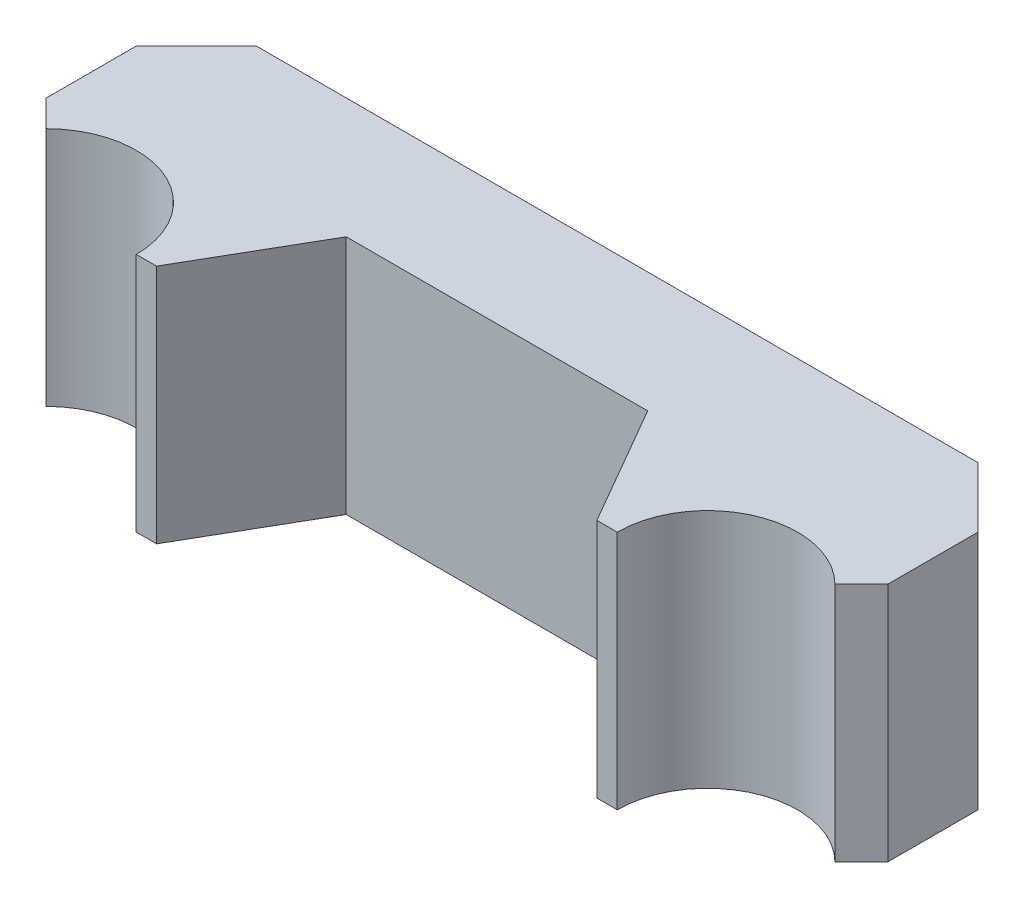
ISO-10303-21;
HEADER;
FILE_DESCRIPTION(('STEP AP214'),'2;1');
FILE_NAME('part.step','',(''),(''),'','','');
FILE_SCHEMA(('AUTOMOTIVE_DESIGN { 1 0 10303 214 1 1 1 1 }'));
ENDSEC;
DATA;
#1=APPLICATION_CONTEXT('core data for automotive mechanical design processes');
#2=APPLICATION_PROTOCOL_DEFINITION('international standard','automotive_design',2000,#1);
#3=PRODUCT_CONTEXT('',#1,'mechanical');
#4=PRODUCT('Part','Part','',(#3));
#5=PRODUCT_RELATED_PRODUCT_CATEGORY('part','',(#4));
#6=PRODUCT_DEFINITION_FORMATION('','',#4);
#7=PRODUCT_DEFINITION_CONTEXT('part definition',#1,'design');
#8=PRODUCT_DEFINITION('design','',#6,#7);
#9=PRODUCT_DEFINITION_SHAPE('','',#8);
#10=(LENGTH_UNIT() NAMED_UNIT(*) SI_UNIT(.MILLI.,.METRE.));
#11=(NAMED_UNIT(*) PLANE_ANGLE_UNIT() SI_UNIT($,.RADIAN.));
#12=(NAMED_UNIT(*) SI_UNIT($,.STERADIAN.) SOLID_ANGLE_UNIT());
#13=UNCERTAINTY_MEASURE_WITH_UNIT(LENGTH_MEASURE(1.E-05),#10,'distance_accuracy_value','');
#14=(GEOMETRIC_REPRESENTATION_CONTEXT(3) GLOBAL_UNCERTAINTY_ASSIGNED_CONTEXT((#13)) GLOBAL_UNIT_ASSIGNED_CONTEXT((#10,
#11,#12)) REPRESENTATION_CONTEXT('',''));
#15=CARTESIAN_POINT('',(0.,0.,0.));
#16=DIRECTION('',(0.,0.,1.));
#17=DIRECTION('',(1.,0.,0.));
#18=AXIS2_PLACEMENT_3D('',#15,#16,#17);
#19=CARTESIAN_POINT('',(0.,10.,-20.));
#20=DIRECTION('',(0.,0.,1.));
#21=DIRECTION('',(1.,0.,0.));
#22=AXIS2_PLACEMENT_3D('',#19,#20,#21);
#23=PLANE('',#22);
#24=DIRECTION('',(-1.,0.,0.));
#25=VECTOR('',#24,1.);
#26=CARTESIAN_POINT('',(0.,-10.,-20.));
#27=LINE('',#26,#25);
#28=CARTESIAN_POINT('',(30.,-10.,-20.));
#29=VERTEX_POINT('',#28);
#30=CARTESIAN_POINT('',(-30.,-10.,-20.));
#31=VERTEX_POINT('',#30);
#32=EDGE_CURVE('E132',#29,#31,#27,.T.);
#33=ORIENTED_EDGE('',*,*,#32,.T.);
#34=DIRECTION('',(0.,-1.,0.));
#35=VECTOR('',#34,1.);
#36=CARTESIAN_POINT('',(-30.,10.,-20.));
#37=LINE('',#36,#35);
#38=CARTESIAN_POINT('',(-30.,10.,-20.));
#39=VERTEX_POINT('',#38);
#40=EDGE_CURVE('E11',#39,#31,#37,.T.);
#41=ORIENTED_EDGE('',*,*,#40,.F.);
#42=DIRECTION('',(-1.,0.,0.));
#43=VECTOR('',#42,1.);
#44=CARTESIAN_POINT('',(0.,10.,-20.));
#45=LINE('',#44,#43);
#46=CARTESIAN_POINT('',(30.,10.,-20.));
#47=VERTEX_POINT('',#46);
#48=EDGE_CURVE('E87',#47,#39,#45,.T.);
#49=ORIENTED_EDGE('',*,*,#48,.F.);
#50=DIRECTION('',(0.,-1.,0.));
#51=VECTOR('',#50,1.);
#52=CARTESIAN_POINT('',(30.,10.,-20.));
#53=LINE('',#52,#51);
#54=EDGE_CURVE('E136',#47,#29,#53,.T.);
#55=ORIENTED_EDGE('',*,*,#54,.T.);
#56=EDGE_LOOP('',(#33,#41,#49,#55));
#57=FACE_BOUND('',#56,.T.);
#58=ADVANCED_FACE('F35',(#57),#23,.F.);
#59=CARTESIAN_POINT('',(-24.9999999999999,10.,-25.0000000000001));
#60=DIRECTION('',(-0.707106781186544,0.,-0.707106781186551));
#61=DIRECTION('',(-0.707106781186551,0.,0.707106781186544));
#62=AXIS2_PLACEMENT_3D('',#59,#60,#61);
#63=PLANE('',#62);
#64=DIRECTION('',(0.707106781186551,0.,-0.707106781186544));
#65=VECTOR('',#64,1.);
#66=CARTESIAN_POINT('',(-24.9999999999999,-10.,-25.0000000000001));
#67=LINE('',#66,#65);
#68=CARTESIAN_POINT('',(-35.,-10.,-15.));
#69=VERTEX_POINT('',#68);
#70=EDGE_CURVE('E135',#69,#31,#67,.T.);
#71=ORIENTED_EDGE('',*,*,#70,.F.);
#72=DIRECTION('',(0.,-1.,0.));
#73=VECTOR('',#72,1.);
#74=CARTESIAN_POINT('',(-35.,10.,-15.));
#75=LINE('',#74,#73);
#76=CARTESIAN_POINT('',(-35.,10.,-15.));
#77=VERTEX_POINT('',#76);
#78=EDGE_CURVE('E43',#77,#69,#75,.T.);
#79=ORIENTED_EDGE('',*,*,#78,.F.);
#80=DIRECTION('',(0.707106781186551,0.,-0.707106781186544));
#81=VECTOR('',#80,1.);
#82=CARTESIAN_POINT('',(-24.9999999999999,10.,-25.0000000000001));
#83=LINE('',#82,#81);
#84=EDGE_CURVE('E173',#77,#39,#83,.T.);
#85=ORIENTED_EDGE('',*,*,#84,.T.);
#86=ORIENTED_EDGE('',*,*,#40,.T.);
#87=EDGE_LOOP('',(#71,#79,#85,#86));
#88=FACE_BOUND('',#87,.T.);
#89=ADVANCED_FACE('F166',(#88),#63,.T.);
#90=CARTESIAN_POINT('',(-35.,10.,0.));
#91=DIRECTION('',(-1.,0.,0.));
#92=DIRECTION('',(0.,0.,1.));
#93=AXIS2_PLACEMENT_3D('',#90,#91,#92);
#94=PLANE('',#93);
#95=DIRECTION('',(0.,0.,-1.));
#96=VECTOR('',#95,1.);
#97=CARTESIAN_POINT('',(-35.,-10.,0.));
#98=LINE('',#97,#96);
#99=CARTESIAN_POINT('',(-35.,-10.,-7.50000000000008));
#100=VERTEX_POINT('',#99);
#101=EDGE_CURVE('E139',#100,#69,#98,.T.);
#102=ORIENTED_EDGE('',*,*,#101,.F.);
#103=DIRECTION('',(0.,-1.,0.));
#104=VECTOR('',#103,1.);
#105=CARTESIAN_POINT('',(-35.,10.,-7.50000000000008));
#106=LINE('',#105,#104);
#107=CARTESIAN_POINT('',(-35.,10.,-7.50000000000008));
#108=VERTEX_POINT('',#107);
#109=EDGE_CURVE('E157',#108,#100,#106,.T.);
#110=ORIENTED_EDGE('',*,*,#109,.F.);
#111=DIRECTION('',(0.,0.,-1.));
#112=VECTOR('',#111,1.);
#113=CARTESIAN_POINT('',(-35.,10.,0.));
#114=LINE('',#113,#112);
#115=EDGE_CURVE('E163',#108,#77,#114,.T.);
#116=ORIENTED_EDGE('',*,*,#115,.T.);
#117=ORIENTED_EDGE('',*,*,#78,.T.);
#118=EDGE_LOOP('',(#102,#110,#116,#117));
#119=FACE_BOUND('',#118,.T.);
#120=ADVANCED_FACE('F162',(#119),#94,.T.);
#121=CARTESIAN_POINT('',(-13.7500000000001,10.,13.75));
#122=DIRECTION('',(0.707106781186551,0.,-0.707106781186544));
#123=DIRECTION('',(-0.707106781186544,0.,-0.707106781186551));
#124=AXIS2_PLACEMENT_3D('',#121,#122,#123);
#125=PLANE('',#124);
#126=DIRECTION('',(0.707106781186544,0.,0.707106781186551));
#127=VECTOR('',#126,1.);
#128=CARTESIAN_POINT('',(-13.7500000000001,-10.,13.75));
#129=LINE('',#128,#127);
#130=CARTESIAN_POINT('',(-32.8033008588991,-10.,-5.30330085889914));
#131=VERTEX_POINT('',#130);
#132=EDGE_CURVE('E142',#100,#131,#129,.T.);
#133=ORIENTED_EDGE('',*,*,#132,.T.);
#134=DIRECTION('',(0.,-1.,0.));
#135=VECTOR('',#134,1.);
#136=CARTESIAN_POINT('',(-32.8033008588991,10.,-5.30330085889914));
#137=LINE('',#136,#135);
#138=CARTESIAN_POINT('',(-32.8033008588991,10.,-5.30330085889914));
#139=VERTEX_POINT('',#138);
#140=EDGE_CURVE('E113',#139,#131,#137,.T.);
#141=ORIENTED_EDGE('',*,*,#140,.F.);
#142=DIRECTION('',(0.707106781186544,0.,0.707106781186551));
#143=VECTOR('',#142,1.);
#144=CARTESIAN_POINT('',(-13.7500000000001,10.,13.75));
#145=LINE('',#144,#143);
#146=EDGE_CURVE('E121',#108,#139,#145,.T.);
#147=ORIENTED_EDGE('',*,*,#146,.F.);
#148=ORIENTED_EDGE('',*,*,#109,.T.);
#149=EDGE_LOOP('',(#133,#141,#147,#148));
#150=FACE_BOUND('',#149,.T.);
#151=ADVANCED_FACE('F172',(#150),#125,.F.);
#152=CARTESIAN_POINT('',(-27.5,10.,0.));
#153=DIRECTION('',(0.,-1.,0.));
#154=DIRECTION('',(0.,0.,-1.));
#155=AXIS2_PLACEMENT_3D('',#152,#153,#154);
#156=CYLINDRICAL_SURFACE('',#155,7.5);
#157=CARTESIAN_POINT('',(-27.5,-10.,0.));
#158=DIRECTION('',(0.,1.,0.));
#159=DIRECTION('',(0.,0.,1.));
#160=AXIS2_PLACEMENT_3D('',#157,#158,#159);
#161=CIRCLE('',#160,7.5);
#162=CARTESIAN_POINT('',(-20.,-10.,0.));
#163=VERTEX_POINT('',#162);
#164=EDGE_CURVE('E109',#163,#131,#161,.T.);
#165=ORIENTED_EDGE('',*,*,#164,.F.);
#166=DIRECTION('',(0.,-1.,0.));
#167=VECTOR('',#166,1.);
#168=CARTESIAN_POINT('',(-20.,10.,0.));
#169=LINE('',#168,#167);
#170=CARTESIAN_POINT('',(-20.,10.,0.));
#171=VERTEX_POINT('',#170);
#172=EDGE_CURVE('E104',#171,#163,#169,.T.);
#173=ORIENTED_EDGE('',*,*,#172,.F.);
#174=CARTESIAN_POINT('',(-27.5,10.,0.));
#175=DIRECTION('',(0.,1.,0.));
#176=DIRECTION('',(0.,0.,1.));
#177=AXIS2_PLACEMENT_3D('',#174,#175,#176);
#178=CIRCLE('',#177,7.5);
#179=EDGE_CURVE('E107',#171,#139,#178,.T.);
#180=ORIENTED_EDGE('',*,*,#179,.T.);
#181=ORIENTED_EDGE('',*,*,#140,.T.);
#182=EDGE_LOOP('',(#165,#173,#180,#181));
#183=FACE_BOUND('',#182,.T.);
#184=ADVANCED_FACE('F106',(#183),#156,.F.);
#185=CARTESIAN_POINT('',(0.,10.,0.));
#186=DIRECTION('',(0.,0.,1.));
#187=DIRECTION('',(1.,0.,0.));
#188=AXIS2_PLACEMENT_3D('',#185,#186,#187);
#189=PLANE('',#188);
#190=DIRECTION('',(-1.,0.,0.));
#191=VECTOR('',#190,1.);
#192=CARTESIAN_POINT('',(0.,-10.,0.));
#193=LINE('',#192,#191);
#194=CARTESIAN_POINT('',(-18.3077476786496,-10.,0.));
#195=VERTEX_POINT('',#194);
#196=EDGE_CURVE('E146',#195,#163,#193,.T.);
#197=ORIENTED_EDGE('',*,*,#196,.F.);
#198=DIRECTION('',(0.,-1.,0.));
#199=VECTOR('',#198,1.);
#200=CARTESIAN_POINT('',(-18.3077476786496,10.,0.));
#201=LINE('',#200,#199);
#202=CARTESIAN_POINT('',(-18.3077476786496,10.,0.));
#203=VERTEX_POINT('',#202);
#204=EDGE_CURVE('E74',#203,#195,#201,.T.);
#205=ORIENTED_EDGE('',*,*,#204,.F.);
#206=DIRECTION('',(-1.,0.,0.));
#207=VECTOR('',#206,1.);
#208=CARTESIAN_POINT('',(0.,10.,0.));
#209=LINE('',#208,#207);
#210=EDGE_CURVE('E118',#203,#171,#209,.T.);
#211=ORIENTED_EDGE('',*,*,#210,.T.);
#212=ORIENTED_EDGE('',*,*,#172,.T.);
#213=EDGE_LOOP('',(#197,#205,#211,#212));
#214=FACE_BOUND('',#213,.T.);
#215=ADVANCED_FACE('F124',(#214),#189,.T.);
#216=CARTESIAN_POINT('',(-13.7308107589873,10.,-7.92748728789306));
#217=DIRECTION('',(0.86602540378444,0.,0.499999999999998));
#218=DIRECTION('',(0.499999999999998,0.,-0.86602540378444));
#219=AXIS2_PLACEMENT_3D('',#216,#217,#218);
#220=PLANE('',#219);
#221=DIRECTION('',(-0.499999999999998,0.,0.86602540378444));
#222=VECTOR('',#221,1.);
#223=CARTESIAN_POINT('',(-13.7308107589873,-10.,-7.92748728789306));
#224=LINE('',#223,#222);
#225=CARTESIAN_POINT('',(-12.5342449867534,-10.,-10.));
#226=VERTEX_POINT('',#225);
#227=EDGE_CURVE('E148',#226,#195,#224,.T.);
#228=ORIENTED_EDGE('',*,*,#227,.F.);
#229=DIRECTION('',(0.,-1.,0.));
#230=VECTOR('',#229,1.);
#231=CARTESIAN_POINT('',(-12.5342449867534,10.,-10.));
#232=LINE('',#231,#230);
#233=CARTESIAN_POINT('',(-12.5342449867534,10.,-10.));
#234=VERTEX_POINT('',#233);
#235=EDGE_CURVE('E51',#234,#226,#232,.T.);
#236=ORIENTED_EDGE('',*,*,#235,.F.);
#237=DIRECTION('',(-0.499999999999998,0.,0.86602540378444));
#238=VECTOR('',#237,1.);
#239=CARTESIAN_POINT('',(-13.7308107589873,10.,-7.92748728789306));
#240=LINE('',#239,#238);
#241=EDGE_CURVE('E125',#234,#203,#240,.T.);
#242=ORIENTED_EDGE('',*,*,#241,.T.);
#243=ORIENTED_EDGE('',*,*,#204,.T.);
#244=EDGE_LOOP('',(#228,#236,#242,#243));
#245=FACE_BOUND('',#244,.T.);
#246=ADVANCED_FACE('F284',(#245),#220,.T.);
#247=CARTESIAN_POINT('',(0.,10.,-10.));
#248=DIRECTION('',(0.,0.,1.));
#249=DIRECTION('',(1.,0.,0.));
#250=AXIS2_PLACEMENT_3D('',#247,#248,#249);
#251=PLANE('',#250);
#252=DIRECTION('',(-1.,0.,0.));
#253=VECTOR('',#252,1.);
#254=CARTESIAN_POINT('',(0.,-10.,-10.));
#255=LINE('',#254,#253);
#256=CARTESIAN_POINT('',(12.5342449867534,-10.,-10.));
#257=VERTEX_POINT('',#256);
#258=EDGE_CURVE('E151',#257,#226,#255,.T.);
#259=ORIENTED_EDGE('',*,*,#258,.F.);
#260=DIRECTION('',(0.,-1.,0.));
#261=VECTOR('',#260,1.);
#262=CARTESIAN_POINT('',(12.5342449867534,10.,-10.));
#263=LINE('',#262,#261);
#264=CARTESIAN_POINT('',(12.5342449867534,10.,-10.));
#265=VERTEX_POINT('',#264);
#266=EDGE_CURVE('E195',#265,#257,#263,.T.);
#267=ORIENTED_EDGE('',*,*,#266,.F.);
#268=DIRECTION('',(-1.,0.,0.));
#269=VECTOR('',#268,1.);
#270=CARTESIAN_POINT('',(0.,10.,-10.));
#271=LINE('',#270,#269);
#272=EDGE_CURVE('E127',#265,#234,#271,.T.);
#273=ORIENTED_EDGE('',*,*,#272,.T.);
#274=ORIENTED_EDGE('',*,*,#235,.T.);
#275=EDGE_LOOP('',(#259,#267,#273,#274));
#276=FACE_BOUND('',#275,.T.);
#277=ADVANCED_FACE('F262',(#276),#251,.T.);
#278=CARTESIAN_POINT('',(0.,10.,0.));
#279=DIRECTION('',(0.,1.,0.));
#280=DIRECTION('',(0.,0.,1.));
#281=AXIS2_PLACEMENT_3D('',#278,#279,#280);
#282=PLANE('',#281);
#283=ORIENTED_EDGE('',*,*,#272,.F.);
#284=DIRECTION('',(0.499999999999998,0.,0.86602540378444));
#285=VECTOR('',#284,1.);
#286=CARTESIAN_POINT('',(13.7308107589873,10.,-7.92748728789306));
#287=LINE('',#286,#285);
#288=CARTESIAN_POINT('',(18.3077476786496,10.,0.));
#289=VERTEX_POINT('',#288);
#290=EDGE_CURVE('E198',#265,#289,#287,.T.);
#291=ORIENTED_EDGE('',*,*,#290,.T.);
#292=DIRECTION('',(1.,0.,0.));
#293=VECTOR('',#292,1.);
#294=CARTESIAN_POINT('',(0.,10.,0.));
#295=LINE('',#294,#293);
#296=CARTESIAN_POINT('',(20.,10.,0.));
#297=VERTEX_POINT('',#296);
#298=EDGE_CURVE('E220',#289,#297,#295,.T.);
#299=ORIENTED_EDGE('',*,*,#298,.T.);
#300=CARTESIAN_POINT('',(27.5,10.,0.));
#301=DIRECTION('',(0.,-1.,0.));
#302=DIRECTION('',(0.,0.,1.));
#303=AXIS2_PLACEMENT_3D('',#300,#301,#302);
#304=CIRCLE('',#303,7.5);
#305=CARTESIAN_POINT('',(32.8033008588991,10.,-5.30330085889914));
#306=VERTEX_POINT('',#305);
#307=EDGE_CURVE('E223',#297,#306,#304,.T.);
#308=ORIENTED_EDGE('',*,*,#307,.T.);
#309=DIRECTION('',(-0.707106781186544,0.,0.707106781186551));
#310=VECTOR('',#309,1.);
#311=CARTESIAN_POINT('',(13.7500000000001,10.,13.75));
#312=LINE('',#311,#310);
#313=CARTESIAN_POINT('',(35.,10.,-7.50000000000008));
#314=VERTEX_POINT('',#313);
#315=EDGE_CURVE('E226',#314,#306,#312,.T.);
#316=ORIENTED_EDGE('',*,*,#315,.F.);
#317=DIRECTION('',(0.,0.,-1.));
#318=VECTOR('',#317,1.);
#319=CARTESIAN_POINT('',(35.,10.,0.));
#320=LINE('',#319,#318);
#321=CARTESIAN_POINT('',(35.,10.,-15.));
#322=VERTEX_POINT('',#321);
#323=EDGE_CURVE('E229',#314,#322,#320,.T.);
#324=ORIENTED_EDGE('',*,*,#323,.T.);
#325=DIRECTION('',(-0.707106781186551,0.,-0.707106781186544));
#326=VECTOR('',#325,1.);
#327=CARTESIAN_POINT('',(24.9999999999999,10.,-25.0000000000001));
#328=LINE('',#327,#326);
#329=EDGE_CURVE('E202',#322,#47,#328,.T.);
#330=ORIENTED_EDGE('',*,*,#329,.T.);
#331=ORIENTED_EDGE('',*,*,#48,.T.);
#332=ORIENTED_EDGE('',*,*,#84,.F.);
#333=ORIENTED_EDGE('',*,*,#115,.F.);
#334=ORIENTED_EDGE('',*,*,#146,.T.);
#335=ORIENTED_EDGE('',*,*,#179,.F.);
#336=ORIENTED_EDGE('',*,*,#210,.F.);
#337=ORIENTED_EDGE('',*,*,#241,.F.);
#338=EDGE_LOOP('',(#283,#291,#299,#308,#316,#324,#330,#331,#332,#333,#334,#335,#336,#337));
#339=FACE_BOUND('',#338,.T.);
#340=ADVANCED_FACE('F117',(#339),#282,.T.);
#341=CARTESIAN_POINT('',(0.,-10.,0.));
#342=DIRECTION('',(0.,1.,0.));
#343=DIRECTION('',(0.,0.,1.));
#344=AXIS2_PLACEMENT_3D('',#341,#342,#343);
#345=PLANE('',#344);
#346=ORIENTED_EDGE('',*,*,#32,.F.);
#347=DIRECTION('',(-0.707106781186551,0.,-0.707106781186544));
#348=VECTOR('',#347,1.);
#349=CARTESIAN_POINT('',(24.9999999999999,-10.,-25.0000000000001));
#350=LINE('',#349,#348);
#351=CARTESIAN_POINT('',(35.,-10.,-15.));
#352=VERTEX_POINT('',#351);
#353=EDGE_CURVE('E215',#352,#29,#350,.T.);
#354=ORIENTED_EDGE('',*,*,#353,.F.);
#355=DIRECTION('',(0.,0.,-1.));
#356=VECTOR('',#355,1.);
#357=CARTESIAN_POINT('',(35.,-10.,0.));
#358=LINE('',#357,#356);
#359=CARTESIAN_POINT('',(35.,-10.,-7.50000000000008));
#360=VERTEX_POINT('',#359);
#361=EDGE_CURVE('E212',#360,#352,#358,.T.);
#362=ORIENTED_EDGE('',*,*,#361,.F.);
#363=DIRECTION('',(-0.707106781186544,0.,0.707106781186551));
#364=VECTOR('',#363,1.);
#365=CARTESIAN_POINT('',(13.7500000000001,-10.,13.75));
#366=LINE('',#365,#364);
#367=CARTESIAN_POINT('',(32.8033008588991,-10.,-5.30330085889914));
#368=VERTEX_POINT('',#367);
#369=EDGE_CURVE('E209',#360,#368,#366,.T.);
#370=ORIENTED_EDGE('',*,*,#369,.T.);
#371=CARTESIAN_POINT('',(27.5,-10.,0.));
#372=DIRECTION('',(0.,-1.,0.));
#373=DIRECTION('',(0.,0.,1.));
#374=AXIS2_PLACEMENT_3D('',#371,#372,#373);
#375=CIRCLE('',#374,7.5);
#376=CARTESIAN_POINT('',(20.,-10.,0.));
#377=VERTEX_POINT('',#376);
#378=EDGE_CURVE('E206',#377,#368,#375,.T.);
#379=ORIENTED_EDGE('',*,*,#378,.F.);
#380=DIRECTION('',(1.,0.,0.));
#381=VECTOR('',#380,1.);
#382=CARTESIAN_POINT('',(0.,-10.,0.));
#383=LINE('',#382,#381);
#384=CARTESIAN_POINT('',(18.3077476786496,-10.,0.));
#385=VERTEX_POINT('',#384);
#386=EDGE_CURVE('E203',#385,#377,#383,.T.);
#387=ORIENTED_EDGE('',*,*,#386,.F.);
#388=DIRECTION('',(0.499999999999998,0.,0.86602540378444));
#389=VECTOR('',#388,1.);
#390=CARTESIAN_POINT('',(13.7308107589873,-10.,-7.92748728789306));
#391=LINE('',#390,#389);
#392=EDGE_CURVE('E199',#257,#385,#391,.T.);
#393=ORIENTED_EDGE('',*,*,#392,.F.);
#394=ORIENTED_EDGE('',*,*,#258,.T.);
#395=ORIENTED_EDGE('',*,*,#227,.T.);
#396=ORIENTED_EDGE('',*,*,#196,.T.);
#397=ORIENTED_EDGE('',*,*,#164,.T.);
#398=ORIENTED_EDGE('',*,*,#132,.F.);
#399=ORIENTED_EDGE('',*,*,#101,.T.);
#400=ORIENTED_EDGE('',*,*,#70,.T.);
#401=EDGE_LOOP('',(#346,#354,#362,#370,#379,#387,#393,#394,#395,#396,#397,#398,#399,#400));
#402=FACE_BOUND('',#401,.T.);
#403=ADVANCED_FACE('F170',(#402),#345,.F.);
#404=CARTESIAN_POINT('',(24.9999999999999,10.,-25.0000000000001));
#405=DIRECTION('',(0.707106781186544,0.,-0.707106781186551));
#406=DIRECTION('',(0.707106781186551,0.,0.707106781186544));
#407=AXIS2_PLACEMENT_3D('',#404,#405,#406);
#408=PLANE('',#407);
#409=ORIENTED_EDGE('',*,*,#353,.T.);
#410=ORIENTED_EDGE('',*,*,#54,.F.);
#411=ORIENTED_EDGE('',*,*,#329,.F.);
#412=DIRECTION('',(0.,-1.,0.));
#413=VECTOR('',#412,1.);
#414=CARTESIAN_POINT('',(35.,10.,-15.));
#415=LINE('',#414,#413);
#416=EDGE_CURVE('E180',#322,#352,#415,.T.);
#417=ORIENTED_EDGE('',*,*,#416,.T.);
#418=EDGE_LOOP('',(#409,#410,#411,#417));
#419=FACE_BOUND('',#418,.T.);
#420=ADVANCED_FACE('F241',(#419),#408,.T.);
#421=CARTESIAN_POINT('',(35.,10.,0.));
#422=DIRECTION('',(1.,0.,0.));
#423=DIRECTION('',(0.,0.,1.));
#424=AXIS2_PLACEMENT_3D('',#421,#422,#423);
#425=PLANE('',#424);
#426=ORIENTED_EDGE('',*,*,#361,.T.);
#427=ORIENTED_EDGE('',*,*,#416,.F.);
#428=ORIENTED_EDGE('',*,*,#323,.F.);
#429=DIRECTION('',(0.,-1.,0.));
#430=VECTOR('',#429,1.);
#431=CARTESIAN_POINT('',(35.,10.,-7.50000000000008));
#432=LINE('',#431,#430);
#433=EDGE_CURVE('E183',#314,#360,#432,.T.);
#434=ORIENTED_EDGE('',*,*,#433,.T.);
#435=EDGE_LOOP('',(#426,#427,#428,#434));
#436=FACE_BOUND('',#435,.T.);
#437=ADVANCED_FACE('F360',(#436),#425,.T.);
#438=CARTESIAN_POINT('',(13.7500000000001,10.,13.75));
#439=DIRECTION('',(-0.707106781186551,0.,-0.707106781186544));
#440=DIRECTION('',(0.707106781186544,0.,-0.707106781186551));
#441=AXIS2_PLACEMENT_3D('',#438,#439,#440);
#442=PLANE('',#441);
#443=ORIENTED_EDGE('',*,*,#369,.F.);
#444=ORIENTED_EDGE('',*,*,#433,.F.);
#445=ORIENTED_EDGE('',*,*,#315,.T.);
#446=DIRECTION('',(0.,-1.,0.));
#447=VECTOR('',#446,1.);
#448=CARTESIAN_POINT('',(32.8033008588991,10.,-5.30330085889914));
#449=LINE('',#448,#447);
#450=EDGE_CURVE('E186',#306,#368,#449,.T.);
#451=ORIENTED_EDGE('',*,*,#450,.T.);
#452=EDGE_LOOP('',(#443,#444,#445,#451));
#453=FACE_BOUND('',#452,.T.);
#454=ADVANCED_FACE('F369',(#453),#442,.F.);
#455=CARTESIAN_POINT('',(27.5,10.,0.));
#456=DIRECTION('',(0.,-1.,0.));
#457=DIRECTION('',(0.,0.,-1.));
#458=AXIS2_PLACEMENT_3D('',#455,#456,#457);
#459=CYLINDRICAL_SURFACE('',#458,7.5);
#460=ORIENTED_EDGE('',*,*,#378,.T.);
#461=ORIENTED_EDGE('',*,*,#450,.F.);
#462=ORIENTED_EDGE('',*,*,#307,.F.);
#463=DIRECTION('',(0.,-1.,0.));
#464=VECTOR('',#463,1.);
#465=CARTESIAN_POINT('',(20.,10.,0.));
#466=LINE('',#465,#464);
#467=EDGE_CURVE('E189',#297,#377,#466,.T.);
#468=ORIENTED_EDGE('',*,*,#467,.T.);
#469=EDGE_LOOP('',(#460,#461,#462,#468));
#470=FACE_BOUND('',#469,.T.);
#471=ADVANCED_FACE('F274',(#470),#459,.F.);
#472=CARTESIAN_POINT('',(0.,10.,0.));
#473=DIRECTION('',(0.,0.,1.));
#474=DIRECTION('',(-1.,0.,0.));
#475=AXIS2_PLACEMENT_3D('',#472,#473,#474);
#476=PLANE('',#475);
#477=ORIENTED_EDGE('',*,*,#386,.T.);
#478=ORIENTED_EDGE('',*,*,#467,.F.);
#479=ORIENTED_EDGE('',*,*,#298,.F.);
#480=DIRECTION('',(0.,-1.,0.));
#481=VECTOR('',#480,1.);
#482=CARTESIAN_POINT('',(18.3077476786496,10.,0.));
#483=LINE('',#482,#481);
#484=EDGE_CURVE('E192',#289,#385,#483,.T.);
#485=ORIENTED_EDGE('',*,*,#484,.T.);
#486=EDGE_LOOP('',(#477,#478,#479,#485));
#487=FACE_BOUND('',#486,.T.);
#488=ADVANCED_FACE('F269',(#487),#476,.T.);
#489=CARTESIAN_POINT('',(13.7308107589873,10.,-7.92748728789306));
#490=DIRECTION('',(-0.86602540378444,0.,0.499999999999998));
#491=DIRECTION('',(-0.499999999999998,0.,-0.86602540378444));
#492=AXIS2_PLACEMENT_3D('',#489,#490,#491);
#493=PLANE('',#492);
#494=ORIENTED_EDGE('',*,*,#392,.T.);
#495=ORIENTED_EDGE('',*,*,#484,.F.);
#496=ORIENTED_EDGE('',*,*,#290,.F.);
#497=ORIENTED_EDGE('',*,*,#266,.T.);
#498=EDGE_LOOP('',(#494,#495,#496,#497));
#499=FACE_BOUND('',#498,.T.);
#500=ADVANCED_FACE('F264',(#499),#493,.T.);
#501=CLOSED_SHELL('',(#58,#89,#120,#151,#184,#215,#246,#277,#340,#403,#420,#437,#454,#471,#488,#500));
#502=MANIFOLD_SOLID_BREP('B2',#501);
#503=ADVANCED_BREP_SHAPE_REPRESENTATION('',(#18,#502),#14);
#504=SHAPE_DEFINITION_REPRESENTATION(#9,#503);
ENDSEC;
END-ISO-10303-21;
